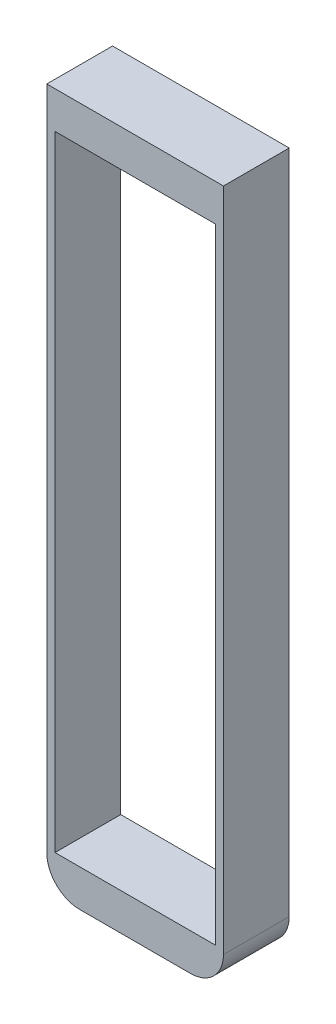
ISO-10303-21;
HEADER;
FILE_DESCRIPTION(('STEP AP214'),'2;1');
FILE_NAME('part.step','',(''),(''),'','','');
FILE_SCHEMA(('AUTOMOTIVE_DESIGN { 1 0 10303 214 1 1 1 1 }'));
ENDSEC;
DATA;
#1=APPLICATION_CONTEXT('core data for automotive mechanical design processes');
#2=APPLICATION_PROTOCOL_DEFINITION('international standard','automotive_design',2000,#1);
#3=PRODUCT_CONTEXT('',#1,'mechanical');
#4=PRODUCT('Part','Part','',(#3));
#5=PRODUCT_RELATED_PRODUCT_CATEGORY('part','',(#4));
#6=PRODUCT_DEFINITION_FORMATION('','',#4);
#7=PRODUCT_DEFINITION_CONTEXT('part definition',#1,'design');
#8=PRODUCT_DEFINITION('design','',#6,#7);
#9=PRODUCT_DEFINITION_SHAPE('','',#8);
#10=(LENGTH_UNIT() NAMED_UNIT(*) SI_UNIT(.MILLI.,.METRE.));
#11=(NAMED_UNIT(*) PLANE_ANGLE_UNIT() SI_UNIT($,.RADIAN.));
#12=(NAMED_UNIT(*) SI_UNIT($,.STERADIAN.) SOLID_ANGLE_UNIT());
#13=UNCERTAINTY_MEASURE_WITH_UNIT(LENGTH_MEASURE(1.E-05),#10,'distance_accuracy_value','');
#14=(GEOMETRIC_REPRESENTATION_CONTEXT(3) GLOBAL_UNCERTAINTY_ASSIGNED_CONTEXT((#13)) GLOBAL_UNIT_ASSIGNED_CONTEXT((#10,
#11,#12)) REPRESENTATION_CONTEXT('',''));
#15=CARTESIAN_POINT('',(0.,0.,0.));
#16=DIRECTION('',(0.,0.,1.));
#17=DIRECTION('',(1.,0.,0.));
#18=AXIS2_PLACEMENT_3D('',#15,#16,#17);
#19=CARTESIAN_POINT('',(0.,0.,16.));
#20=DIRECTION('',(1.,0.,0.));
#21=DIRECTION('',(0.,0.,-1.));
#22=AXIS2_PLACEMENT_3D('',#19,#20,#21);
#23=PLANE('',#22);
#24=DIRECTION('',(0.,-1.,0.));
#25=VECTOR('',#24,1.);
#26=CARTESIAN_POINT('',(0.,0.,0.));
#27=LINE('',#26,#25);
#28=CARTESIAN_POINT('',(0.,170.,0.));
#29=VERTEX_POINT('',#28);
#30=CARTESIAN_POINT('',(0.,8.,0.));
#31=VERTEX_POINT('',#30);
#32=EDGE_CURVE('E154',#29,#31,#27,.T.);
#33=ORIENTED_EDGE('',*,*,#32,.T.);
#34=DIRECTION('',(0.,0.,-1.));
#35=VECTOR('',#34,1.);
#36=CARTESIAN_POINT('',(0.,8.,16.));
#37=LINE('',#36,#35);
#38=CARTESIAN_POINT('',(0.,8.,16.));
#39=VERTEX_POINT('',#38);
#40=EDGE_CURVE('E11',#31,#39,#37,.F.);
#41=ORIENTED_EDGE('',*,*,#40,.T.);
#42=DIRECTION('',(0.,-1.,0.));
#43=VECTOR('',#42,1.);
#44=CARTESIAN_POINT('',(0.,0.,16.));
#45=LINE('',#44,#43);
#46=CARTESIAN_POINT('',(0.,170.,16.));
#47=VERTEX_POINT('',#46);
#48=EDGE_CURVE('E158',#47,#39,#45,.T.);
#49=ORIENTED_EDGE('',*,*,#48,.F.);
#50=DIRECTION('',(0.,0.,-1.));
#51=VECTOR('',#50,1.);
#52=CARTESIAN_POINT('',(0.,170.,16.));
#53=LINE('',#52,#51);
#54=EDGE_CURVE('E167',#47,#29,#53,.T.);
#55=ORIENTED_EDGE('',*,*,#54,.T.);
#56=EDGE_LOOP('',(#33,#41,#49,#55));
#57=FACE_BOUND('',#56,.T.);
#58=ADVANCED_FACE('F35',(#57),#23,.F.);
#59=CARTESIAN_POINT('',(0.,0.,16.));
#60=DIRECTION('',(0.,1.,0.));
#61=DIRECTION('',(0.,0.,1.));
#62=AXIS2_PLACEMENT_3D('',#59,#60,#61);
#63=PLANE('',#62);
#64=DIRECTION('',(1.,0.,0.));
#65=VECTOR('',#64,1.);
#66=CARTESIAN_POINT('',(0.,0.,0.));
#67=LINE('',#66,#65);
#68=CARTESIAN_POINT('',(8.,0.,0.));
#69=VERTEX_POINT('',#68);
#70=CARTESIAN_POINT('',(35.,0.,0.));
#71=VERTEX_POINT('',#70);
#72=EDGE_CURVE('E169',#69,#71,#67,.T.);
#73=ORIENTED_EDGE('',*,*,#72,.T.);
#74=DIRECTION('',(0.,0.,-1.));
#75=VECTOR('',#74,1.);
#76=CARTESIAN_POINT('',(35.,0.,16.));
#77=LINE('',#76,#75);
#78=CARTESIAN_POINT('',(35.,0.,16.));
#79=VERTEX_POINT('',#78);
#80=EDGE_CURVE('E56',#71,#79,#77,.F.);
#81=ORIENTED_EDGE('',*,*,#80,.T.);
#82=DIRECTION('',(1.,0.,0.));
#83=VECTOR('',#82,1.);
#84=CARTESIAN_POINT('',(0.,0.,16.));
#85=LINE('',#84,#83);
#86=CARTESIAN_POINT('',(8.,0.,16.));
#87=VERTEX_POINT('',#86);
#88=EDGE_CURVE('E160',#87,#79,#85,.T.);
#89=ORIENTED_EDGE('',*,*,#88,.F.);
#90=DIRECTION('',(0.,0.,-1.));
#91=VECTOR('',#90,1.);
#92=CARTESIAN_POINT('',(8.,0.,16.));
#93=LINE('',#92,#91);
#94=EDGE_CURVE('E186',#87,#69,#93,.T.);
#95=ORIENTED_EDGE('',*,*,#94,.T.);
#96=EDGE_LOOP('',(#73,#81,#89,#95));
#97=FACE_BOUND('',#96,.T.);
#98=ADVANCED_FACE('F205',(#97),#63,.F.);
#99=CARTESIAN_POINT('',(43.,0.,16.));
#100=DIRECTION('',(-1.,0.,0.));
#101=DIRECTION('',(0.,0.,1.));
#102=AXIS2_PLACEMENT_3D('',#99,#100,#101);
#103=PLANE('',#102);
#104=DIRECTION('',(0.,1.,0.));
#105=VECTOR('',#104,1.);
#106=CARTESIAN_POINT('',(43.,0.,16.));
#107=LINE('',#106,#105);
#108=CARTESIAN_POINT('',(43.,8.,16.));
#109=VERTEX_POINT('',#108);
#110=CARTESIAN_POINT('',(43.,170.,16.));
#111=VERTEX_POINT('',#110);
#112=EDGE_CURVE('E163',#109,#111,#107,.T.);
#113=ORIENTED_EDGE('',*,*,#112,.F.);
#114=DIRECTION('',(0.,0.,-1.));
#115=VECTOR('',#114,1.);
#116=CARTESIAN_POINT('',(43.,8.,16.));
#117=LINE('',#116,#115);
#118=CARTESIAN_POINT('',(43.,8.,0.));
#119=VERTEX_POINT('',#118);
#120=EDGE_CURVE('E179',#109,#119,#117,.T.);
#121=ORIENTED_EDGE('',*,*,#120,.T.);
#122=DIRECTION('',(0.,1.,0.));
#123=VECTOR('',#122,1.);
#124=CARTESIAN_POINT('',(43.,0.,0.));
#125=LINE('',#124,#123);
#126=CARTESIAN_POINT('',(43.,170.,0.));
#127=VERTEX_POINT('',#126);
#128=EDGE_CURVE('E171',#119,#127,#125,.T.);
#129=ORIENTED_EDGE('',*,*,#128,.T.);
#130=DIRECTION('',(0.,0.,-1.));
#131=VECTOR('',#130,1.);
#132=CARTESIAN_POINT('',(43.,170.,16.));
#133=LINE('',#132,#131);
#134=EDGE_CURVE('E176',#111,#127,#133,.T.);
#135=ORIENTED_EDGE('',*,*,#134,.F.);
#136=EDGE_LOOP('',(#113,#121,#129,#135));
#137=FACE_BOUND('',#136,.T.);
#138=ADVANCED_FACE('F199',(#137),#103,.F.);
#139=CARTESIAN_POINT('',(0.,170.,16.));
#140=DIRECTION('',(0.,-1.,0.));
#141=DIRECTION('',(0.,0.,-1.));
#142=AXIS2_PLACEMENT_3D('',#139,#140,#141);
#143=PLANE('',#142);
#144=DIRECTION('',(-1.,0.,0.));
#145=VECTOR('',#144,1.);
#146=CARTESIAN_POINT('',(0.,170.,0.));
#147=LINE('',#146,#145);
#148=EDGE_CURVE('E161',#127,#29,#147,.T.);
#149=ORIENTED_EDGE('',*,*,#148,.T.);
#150=ORIENTED_EDGE('',*,*,#54,.F.);
#151=DIRECTION('',(-1.,0.,0.));
#152=VECTOR('',#151,1.);
#153=CARTESIAN_POINT('',(0.,170.,16.));
#154=LINE('',#153,#152);
#155=EDGE_CURVE('E165',#111,#47,#154,.T.);
#156=ORIENTED_EDGE('',*,*,#155,.F.);
#157=ORIENTED_EDGE('',*,*,#134,.T.);
#158=EDGE_LOOP('',(#149,#150,#156,#157));
#159=FACE_BOUND('',#158,.T.);
#160=ADVANCED_FACE('F212',(#159),#143,.F.);
#161=CARTESIAN_POINT('',(0.,0.,16.));
#162=DIRECTION('',(0.,0.,-1.));
#163=DIRECTION('',(-1.,0.,0.));
#164=AXIS2_PLACEMENT_3D('',#161,#162,#163);
#165=PLANE('',#164);
#166=DIRECTION('',(-1.,0.,0.));
#167=VECTOR('',#166,1.);
#168=CARTESIAN_POINT('',(1.99999999999998,161.,16.));
#169=LINE('',#168,#167);
#170=CARTESIAN_POINT('',(41.,161.,16.));
#171=VERTEX_POINT('',#170);
#172=CARTESIAN_POINT('',(1.99999999999998,161.,16.));
#173=VERTEX_POINT('',#172);
#174=EDGE_CURVE('E148',#171,#173,#169,.T.);
#175=ORIENTED_EDGE('',*,*,#174,.F.);
#176=DIRECTION('',(0.,1.,0.));
#177=VECTOR('',#176,1.);
#178=CARTESIAN_POINT('',(41.,161.,16.));
#179=LINE('',#178,#177);
#180=CARTESIAN_POINT('',(41.,8.99999999999995,16.));
#181=VERTEX_POINT('',#180);
#182=EDGE_CURVE('E121',#181,#171,#179,.T.);
#183=ORIENTED_EDGE('',*,*,#182,.F.);
#184=DIRECTION('',(1.,0.,0.));
#185=VECTOR('',#184,1.);
#186=CARTESIAN_POINT('',(2.,8.99999999999995,16.));
#187=LINE('',#186,#185);
#188=CARTESIAN_POINT('',(2.,8.99999999999995,16.));
#189=VERTEX_POINT('',#188);
#190=EDGE_CURVE('E139',#189,#181,#187,.T.);
#191=ORIENTED_EDGE('',*,*,#190,.F.);
#192=DIRECTION('',(0.,-1.,0.));
#193=VECTOR('',#192,1.);
#194=CARTESIAN_POINT('',(1.99999999999998,161.,16.));
#195=LINE('',#194,#193);
#196=EDGE_CURVE('E142',#173,#189,#195,.T.);
#197=ORIENTED_EDGE('',*,*,#196,.F.);
#198=EDGE_LOOP('',(#175,#183,#191,#197));
#199=FACE_BOUND('',#198,.T.);
#200=ORIENTED_EDGE('',*,*,#88,.T.);
#201=CARTESIAN_POINT('',(35.,8.,16.));
#202=DIRECTION('',(0.,0.,-1.));
#203=DIRECTION('',(-1.,0.,0.));
#204=AXIS2_PLACEMENT_3D('',#201,#202,#203);
#205=CIRCLE('',#204,8.);
#206=EDGE_CURVE('E43',#79,#109,#205,.F.);
#207=ORIENTED_EDGE('',*,*,#206,.T.);
#208=ORIENTED_EDGE('',*,*,#112,.T.);
#209=ORIENTED_EDGE('',*,*,#155,.T.);
#210=ORIENTED_EDGE('',*,*,#48,.T.);
#211=CARTESIAN_POINT('',(8.,8.,16.));
#212=DIRECTION('',(0.,0.,-1.));
#213=DIRECTION('',(-1.,0.,0.));
#214=AXIS2_PLACEMENT_3D('',#211,#212,#213);
#215=CIRCLE('',#214,8.);
#216=EDGE_CURVE('E190',#39,#87,#215,.F.);
#217=ORIENTED_EDGE('',*,*,#216,.T.);
#218=EDGE_LOOP('',(#200,#207,#208,#209,#210,#217));
#219=FACE_BOUND('',#218,.T.);
#220=ADVANCED_FACE('F194',(#199,#219),#165,.F.);
#221=CARTESIAN_POINT('',(0.,0.,0.));
#222=DIRECTION('',(0.,0.,-1.));
#223=DIRECTION('',(-1.,0.,0.));
#224=AXIS2_PLACEMENT_3D('',#221,#222,#223);
#225=PLANE('',#224);
#226=DIRECTION('',(0.,1.,0.));
#227=VECTOR('',#226,1.);
#228=CARTESIAN_POINT('',(41.,161.,0.));
#229=LINE('',#228,#227);
#230=CARTESIAN_POINT('',(41.,8.99999999999995,0.));
#231=VERTEX_POINT('',#230);
#232=CARTESIAN_POINT('',(41.,161.,0.));
#233=VERTEX_POINT('',#232);
#234=EDGE_CURVE('E118',#231,#233,#229,.T.);
#235=ORIENTED_EDGE('',*,*,#234,.T.);
#236=DIRECTION('',(-1.,0.,0.));
#237=VECTOR('',#236,1.);
#238=CARTESIAN_POINT('',(1.99999999999998,161.,0.));
#239=LINE('',#238,#237);
#240=CARTESIAN_POINT('',(1.99999999999998,161.,0.));
#241=VERTEX_POINT('',#240);
#242=EDGE_CURVE('E130',#233,#241,#239,.T.);
#243=ORIENTED_EDGE('',*,*,#242,.T.);
#244=DIRECTION('',(0.,-1.,0.));
#245=VECTOR('',#244,1.);
#246=CARTESIAN_POINT('',(1.99999999999998,161.,0.));
#247=LINE('',#246,#245);
#248=CARTESIAN_POINT('',(2.,8.99999999999995,0.));
#249=VERTEX_POINT('',#248);
#250=EDGE_CURVE('E134',#241,#249,#247,.T.);
#251=ORIENTED_EDGE('',*,*,#250,.T.);
#252=DIRECTION('',(1.,0.,0.));
#253=VECTOR('',#252,1.);
#254=CARTESIAN_POINT('',(2.,8.99999999999995,0.));
#255=LINE('',#254,#253);
#256=EDGE_CURVE('E126',#249,#231,#255,.T.);
#257=ORIENTED_EDGE('',*,*,#256,.T.);
#258=EDGE_LOOP('',(#235,#243,#251,#257));
#259=FACE_BOUND('',#258,.T.);
#260=ORIENTED_EDGE('',*,*,#128,.F.);
#261=CARTESIAN_POINT('',(35.,8.,0.));
#262=DIRECTION('',(0.,0.,-1.));
#263=DIRECTION('',(-1.,0.,0.));
#264=AXIS2_PLACEMENT_3D('',#261,#262,#263);
#265=CIRCLE('',#264,8.);
#266=EDGE_CURVE('E184',#119,#71,#265,.T.);
#267=ORIENTED_EDGE('',*,*,#266,.T.);
#268=ORIENTED_EDGE('',*,*,#72,.F.);
#269=CARTESIAN_POINT('',(8.,8.,0.));
#270=DIRECTION('',(0.,0.,-1.));
#271=DIRECTION('',(-1.,0.,0.));
#272=AXIS2_PLACEMENT_3D('',#269,#270,#271);
#273=CIRCLE('',#272,8.);
#274=EDGE_CURVE('E182',#69,#31,#273,.T.);
#275=ORIENTED_EDGE('',*,*,#274,.T.);
#276=ORIENTED_EDGE('',*,*,#32,.F.);
#277=ORIENTED_EDGE('',*,*,#148,.F.);
#278=EDGE_LOOP('',(#260,#267,#268,#275,#276,#277));
#279=FACE_BOUND('',#278,.T.);
#280=ADVANCED_FACE('F136',(#259,#279),#225,.T.);
#281=CARTESIAN_POINT('',(41.,161.,0.));
#282=DIRECTION('',(1.,0.,0.));
#283=DIRECTION('',(0.,1.,0.));
#284=AXIS2_PLACEMENT_3D('',#281,#282,#283);
#285=PLANE('',#284);
#286=ORIENTED_EDGE('',*,*,#182,.T.);
#287=DIRECTION('',(0.,0.,1.));
#288=VECTOR('',#287,1.);
#289=CARTESIAN_POINT('',(41.,161.,0.));
#290=LINE('',#289,#288);
#291=EDGE_CURVE('E114',#233,#171,#290,.T.);
#292=ORIENTED_EDGE('',*,*,#291,.F.);
#293=ORIENTED_EDGE('',*,*,#234,.F.);
#294=DIRECTION('',(0.,0.,1.));
#295=VECTOR('',#294,1.);
#296=CARTESIAN_POINT('',(41.,8.99999999999995,0.));
#297=LINE('',#296,#295);
#298=EDGE_CURVE('E152',#231,#181,#297,.T.);
#299=ORIENTED_EDGE('',*,*,#298,.T.);
#300=EDGE_LOOP('',(#286,#292,#293,#299));
#301=FACE_BOUND('',#300,.T.);
#302=ADVANCED_FACE('F116',(#301),#285,.F.);
#303=CARTESIAN_POINT('',(2.,8.99999999999995,0.));
#304=DIRECTION('',(0.,-1.,0.));
#305=DIRECTION('',(0.,0.,-1.));
#306=AXIS2_PLACEMENT_3D('',#303,#304,#305);
#307=PLANE('',#306);
#308=ORIENTED_EDGE('',*,*,#190,.T.);
#309=ORIENTED_EDGE('',*,*,#298,.F.);
#310=ORIENTED_EDGE('',*,*,#256,.F.);
#311=DIRECTION('',(0.,0.,1.));
#312=VECTOR('',#311,1.);
#313=CARTESIAN_POINT('',(2.,8.99999999999995,0.));
#314=LINE('',#313,#312);
#315=EDGE_CURVE('E155',#249,#189,#314,.T.);
#316=ORIENTED_EDGE('',*,*,#315,.T.);
#317=EDGE_LOOP('',(#308,#309,#310,#316));
#318=FACE_BOUND('',#317,.T.);
#319=ADVANCED_FACE('F239',(#318),#307,.F.);
#320=CARTESIAN_POINT('',(1.99999999999998,161.,0.));
#321=DIRECTION('',(-1.,0.,0.));
#322=DIRECTION('',(0.,-1.,0.));
#323=AXIS2_PLACEMENT_3D('',#320,#321,#322);
#324=PLANE('',#323);
#325=ORIENTED_EDGE('',*,*,#196,.T.);
#326=ORIENTED_EDGE('',*,*,#315,.F.);
#327=ORIENTED_EDGE('',*,*,#250,.F.);
#328=DIRECTION('',(0.,0.,1.));
#329=VECTOR('',#328,1.);
#330=CARTESIAN_POINT('',(1.99999999999998,161.,0.));
#331=LINE('',#330,#329);
#332=EDGE_CURVE('E125',#241,#173,#331,.T.);
#333=ORIENTED_EDGE('',*,*,#332,.T.);
#334=EDGE_LOOP('',(#325,#326,#327,#333));
#335=FACE_BOUND('',#334,.T.);
#336=ADVANCED_FACE('F234',(#335),#324,.F.);
#337=CARTESIAN_POINT('',(1.99999999999998,161.,0.));
#338=DIRECTION('',(0.,1.,0.));
#339=DIRECTION('',(0.,0.,1.));
#340=AXIS2_PLACEMENT_3D('',#337,#338,#339);
#341=PLANE('',#340);
#342=ORIENTED_EDGE('',*,*,#174,.T.);
#343=ORIENTED_EDGE('',*,*,#332,.F.);
#344=ORIENTED_EDGE('',*,*,#242,.F.);
#345=ORIENTED_EDGE('',*,*,#291,.T.);
#346=EDGE_LOOP('',(#342,#343,#344,#345));
#347=FACE_BOUND('',#346,.T.);
#348=ADVANCED_FACE('F131',(#347),#341,.F.);
#349=CARTESIAN_POINT('',(35.,8.,16.));
#350=DIRECTION('',(0.,0.,-1.));
#351=DIRECTION('',(-1.,0.,0.));
#352=AXIS2_PLACEMENT_3D('',#349,#350,#351);
#353=CYLINDRICAL_SURFACE('',#352,8.);
#354=ORIENTED_EDGE('',*,*,#206,.F.);
#355=ORIENTED_EDGE('',*,*,#80,.F.);
#356=ORIENTED_EDGE('',*,*,#266,.F.);
#357=ORIENTED_EDGE('',*,*,#120,.F.);
#358=EDGE_LOOP('',(#354,#355,#356,#357));
#359=FACE_BOUND('',#358,.T.);
#360=ADVANCED_FACE('F202',(#359),#353,.T.);
#361=CARTESIAN_POINT('',(8.,8.,16.));
#362=DIRECTION('',(0.,0.,-1.));
#363=DIRECTION('',(-1.,0.,0.));
#364=AXIS2_PLACEMENT_3D('',#361,#362,#363);
#365=CYLINDRICAL_SURFACE('',#364,8.);
#366=ORIENTED_EDGE('',*,*,#216,.F.);
#367=ORIENTED_EDGE('',*,*,#40,.F.);
#368=ORIENTED_EDGE('',*,*,#274,.F.);
#369=ORIENTED_EDGE('',*,*,#94,.F.);
#370=EDGE_LOOP('',(#366,#367,#368,#369));
#371=FACE_BOUND('',#370,.T.);
#372=ADVANCED_FACE('F37',(#371),#365,.T.);
#373=CLOSED_SHELL('',(#58,#98,#138,#160,#220,#280,#302,#319,#336,#348,#360,#372));
#374=MANIFOLD_SOLID_BREP('B2',#373);
#375=ADVANCED_BREP_SHAPE_REPRESENTATION('',(#18,#374),#14);
#376=SHAPE_DEFINITION_REPRESENTATION(#9,#375);
ENDSEC;
END-ISO-10303-21;
